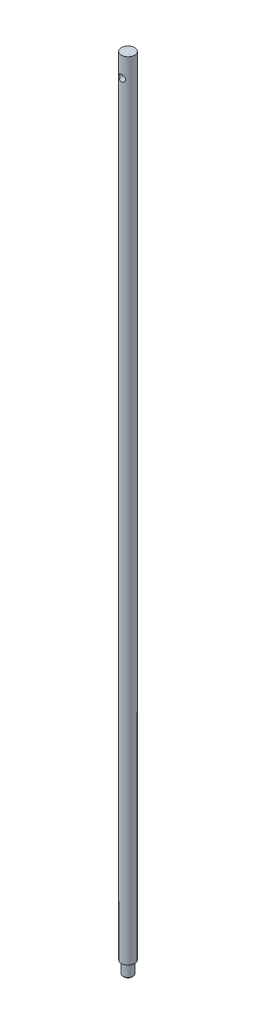
ISO-10303-21;
HEADER;
FILE_DESCRIPTION(('STEP AP214'),'2;1');
FILE_NAME('part.step','',(''),(''),'','','');
FILE_SCHEMA(('AUTOMOTIVE_DESIGN { 1 0 10303 214 1 1 1 1 }'));
ENDSEC;
DATA;
#1=APPLICATION_CONTEXT('core data for automotive mechanical design processes');
#2=APPLICATION_PROTOCOL_DEFINITION('international standard','automotive_design',2000,#1);
#3=PRODUCT_CONTEXT('',#1,'mechanical');
#4=PRODUCT('Part','Part','',(#3));
#5=PRODUCT_RELATED_PRODUCT_CATEGORY('part','',(#4));
#6=PRODUCT_DEFINITION_FORMATION('','',#4);
#7=PRODUCT_DEFINITION_CONTEXT('part definition',#1,'design');
#8=PRODUCT_DEFINITION('design','',#6,#7);
#9=PRODUCT_DEFINITION_SHAPE('','',#8);
#10=(LENGTH_UNIT() NAMED_UNIT(*) SI_UNIT(.MILLI.,.METRE.));
#11=(NAMED_UNIT(*) PLANE_ANGLE_UNIT() SI_UNIT($,.RADIAN.));
#12=(NAMED_UNIT(*) SI_UNIT($,.STERADIAN.) SOLID_ANGLE_UNIT());
#13=UNCERTAINTY_MEASURE_WITH_UNIT(LENGTH_MEASURE(1.E-05),#10,'distance_accuracy_value','');
#14=(GEOMETRIC_REPRESENTATION_CONTEXT(3) GLOBAL_UNCERTAINTY_ASSIGNED_CONTEXT((#13)) GLOBAL_UNIT_ASSIGNED_CONTEXT((#10,
#11,#12)) REPRESENTATION_CONTEXT('',''));
#15=CARTESIAN_POINT('',(0.,0.,0.));
#16=DIRECTION('',(0.,0.,1.));
#17=DIRECTION('',(1.,0.,0.));
#18=AXIS2_PLACEMENT_3D('',#15,#16,#17);
#19=CARTESIAN_POINT('',(-4.7625,0.,0.));
#20=DIRECTION('',(0.,1.,0.));
#21=DIRECTION('',(0.,0.,1.));
#22=AXIS2_PLACEMENT_3D('',#19,#20,#21);
#23=PLANE('',#22);
#24=CARTESIAN_POINT('',(0.,0.,0.));
#25=DIRECTION('',(0.,1.,0.));
#26=DIRECTION('',(0.,0.,1.));
#27=AXIS2_PLACEMENT_3D('',#24,#25,#26);
#28=CIRCLE('',#27,3.49250000000001);
#29=CARTESIAN_POINT('',(0.,0.,3.49250000000001));
#30=VERTEX_POINT('',#29);
#31=EDGE_CURVE('E64',#30,#30,#28,.F.);
#32=ORIENTED_EDGE('',*,*,#31,.T.);
#33=EDGE_LOOP('',(#32));
#34=FACE_BOUND('',#33,.T.);
#35=ADVANCED_FACE('F43',(#34),#23,.F.);
#36=CARTESIAN_POINT('',(0.,768.35,0.));
#37=DIRECTION('',(0.,-1.,0.));
#38=DIRECTION('',(0.,0.,-1.));
#39=AXIS2_PLACEMENT_3D('',#36,#37,#38);
#40=PLANE('',#39);
#41=CARTESIAN_POINT('',(0.,768.35,0.));
#42=DIRECTION('',(0.,-1.,0.));
#43=DIRECTION('',(0.,0.,-1.));
#44=AXIS2_PLACEMENT_3D('',#41,#42,#43);
#45=CIRCLE('',#44,6.35);
#46=CARTESIAN_POINT('',(0.,768.35,-6.35));
#47=VERTEX_POINT('',#46);
#48=EDGE_CURVE('E101',#47,#47,#45,.T.);
#49=ORIENTED_EDGE('',*,*,#48,.F.);
#50=EDGE_LOOP('',(#49));
#51=FACE_BOUND('',#50,.T.);
#52=ADVANCED_FACE('F91',(#51),#40,.F.);
#53=CARTESIAN_POINT('',(0.,0.,0.));
#54=DIRECTION('',(0.,-1.,0.));
#55=DIRECTION('',(0.,0.,-1.));
#56=AXIS2_PLACEMENT_3D('',#53,#54,#55);
#57=CYLINDRICAL_SURFACE('',#56,6.34999999999995);
#58=CARTESIAN_POINT('',(0.,752.475,-6.34999999999995));
#59=CARTESIAN_POINT('',(-0.0834969220594935,752.474999112282,-6.34999931166439));
#60=CARTESIAN_POINT('',(-0.167002655580029,752.471700125554,-6.34834758911697));
#61=CARTESIAN_POINT('',(-0.33337833025876,752.45855412545,-6.3417910582171));
#62=CARTESIAN_POINT('',(-0.41624797895575,752.448704263474,-6.33688483467109));
#63=CARTESIAN_POINT('',(-0.663182030646993,752.409427934954,-6.3174242674832));
#64=CARTESIAN_POINT('',(-0.825450146761548,752.370274922599,-6.2981282729942));
#65=CARTESIAN_POINT('',(-1.13965128900426,752.268009288706,-6.24891823135736));
#66=CARTESIAN_POINT('',(-1.29162180811868,752.204989780757,-6.2190454778682));
#67=CARTESIAN_POINT('',(-1.58264035037876,752.057263926371,-6.15142812041633));
#68=CARTESIAN_POINT('',(-1.72168939123014,751.972559289849,-6.11368413715873));
#69=CARTESIAN_POINT('',(-1.9923410884817,751.778030370266,-6.03111096182977));
#70=CARTESIAN_POINT('',(-2.12298433900093,751.666996422206,-5.98599127270812));
#71=CARTESIAN_POINT('',(-2.36467069069856,751.425603316427,-5.8947053559105));
#72=CARTESIAN_POINT('',(-2.47569885601321,751.295229570233,-5.84853836069038));
#73=CARTESIAN_POINT('',(-2.68368848497886,751.006579052247,-5.75623634934459));
#74=CARTESIAN_POINT('',(-2.77889135161934,750.846922468698,-5.71038146176782));
#75=CARTESIAN_POINT('',(-2.90019349951536,750.595452012825,-5.64919759286357));
#76=CARTESIAN_POINT('',(-2.93705266116893,750.509599938171,-5.63006420805927));
#77=CARTESIAN_POINT('',(-3.00322508739606,750.334414386294,-5.59504604853262));
#78=CARTESIAN_POINT('',(-3.03254280972159,750.245083001819,-5.57915935583423));
#79=CARTESIAN_POINT('',(-3.08174263292981,750.068989448035,-5.55212611635044));
#80=CARTESIAN_POINT('',(-3.10208128111977,749.982389205971,-5.54075429137741));
#81=CARTESIAN_POINT('',(-3.13545600360764,749.807412721006,-5.52193654886439));
#82=CARTESIAN_POINT('',(-3.14849595237256,749.719037446228,-5.5144885485113));
#83=CARTESIAN_POINT('',(-3.16707713053439,749.541293261151,-5.50383875782914));
#84=CARTESIAN_POINT('',(-3.17262287599649,749.451924982013,-5.50063441026517));
#85=CARTESIAN_POINT('',(-3.17614778806993,749.273019215822,-5.49859788398604));
#86=CARTESIAN_POINT('',(-3.17412767659872,749.183481745729,-5.49976528812793));
#87=CARTESIAN_POINT('',(-3.15811930330261,748.937252124276,-5.50899190362727));
#88=CARTESIAN_POINT('',(-3.13621253452965,748.781158270187,-5.52160857357702));
#89=CARTESIAN_POINT('',(-3.07003746372168,748.475353358693,-5.55866493052819));
#90=CARTESIAN_POINT('',(-3.02576203854505,748.325644350977,-5.58310838358071));
#91=CARTESIAN_POINT('',(-2.91531509833646,748.032455703436,-5.64157885407232));
#92=CARTESIAN_POINT('',(-2.84865758129414,747.889202390063,-5.67581583876126));
#93=CARTESIAN_POINT('',(-2.69570761526048,747.615233913826,-5.7500326880763));
#94=CARTESIAN_POINT('',(-2.60940634674624,747.484524420391,-5.79001512927801));
#95=CARTESIAN_POINT('',(-2.4068596424956,747.22189572575,-5.87734289018608));
#96=CARTESIAN_POINT('',(-2.28820488335247,747.091924615143,-5.92497898403933));
#97=CARTESIAN_POINT('',(-2.03058898448424,746.852914857136,-6.01813700574901));
#98=CARTESIAN_POINT('',(-1.89161819563548,746.743886213641,-6.06365791538153));
#99=CARTESIAN_POINT('',(-1.58913989972488,746.54509808028,-6.15003810597673));
#100=CARTESIAN_POINT('',(-1.42479265164794,746.45646851442,-6.19058274974566));
#101=CARTESIAN_POINT('',(-1.08098023585589,746.308841918365,-6.25976272299946));
#102=CARTESIAN_POINT('',(-0.901527205073952,746.249821358868,-6.2884075057894));
#103=CARTESIAN_POINT('',(-0.548533610626888,746.167940596601,-6.32854759690352));
#104=CARTESIAN_POINT('',(-0.375734359385299,746.142490327413,-6.3412667912299));
#105=CARTESIAN_POINT('',(-0.0278752299448881,746.12034947774,-6.3523181771632));
#106=CARTESIAN_POINT('',(0.14718353805996,746.123645272861,-6.35065718436125));
#107=CARTESIAN_POINT('',(0.480164686080307,746.157406235945,-6.33384535408395));
#108=CARTESIAN_POINT('',(0.63836362056414,746.185745791475,-6.31975005060427));
#109=CARTESIAN_POINT('',(0.947441883052949,746.26545587821,-6.28085393924117));
#110=CARTESIAN_POINT('',(1.09832040207135,746.316828948477,-6.25605195113511));
#111=CARTESIAN_POINT('',(1.39347133182507,746.442495130938,-6.1970999823633));
#112=CARTESIAN_POINT('',(1.53743151047818,746.517401584111,-6.16270299610714));
#113=CARTESIAN_POINT('',(1.81121482341037,746.687316425686,-6.0878711846566));
#114=CARTESIAN_POINT('',(1.94103189959924,746.782333377385,-6.04743378954676));
#115=CARTESIAN_POINT('',(2.19636241342673,747.000539350374,-5.95973602709936));
#116=CARTESIAN_POINT('',(2.32020134681973,747.125578607111,-5.91219559251095));
#117=CARTESIAN_POINT('',(2.54589381918869,747.39476235515,-5.81858093231365));
#118=CARTESIAN_POINT('',(2.64773214935249,747.538919952381,-5.77250773963542));
#119=CARTESIAN_POINT('',(2.83117262876716,747.851068601958,-5.68487535288736));
#120=CARTESIAN_POINT('',(2.91155594998013,748.01987576951,-5.64364281441816));
#121=CARTESIAN_POINT('',(3.04191297152938,748.37134446489,-5.57447679537315));
#122=CARTESIAN_POINT('',(3.09192585492219,748.553987797847,-5.54652618900863));
#123=CARTESIAN_POINT('',(3.15551086037918,748.90918995647,-5.51057765714597));
#124=CARTESIAN_POINT('',(3.17212027309711,749.081033750407,-5.50092192343239));
#125=CARTESIAN_POINT('',(3.17718805563876,749.425244442495,-5.49800001145353));
#126=CARTESIAN_POINT('',(3.16565862768385,749.597611081543,-5.50472672904435));
#127=CARTESIAN_POINT('',(3.11761548073658,749.920660103074,-5.53205211477778));
#128=CARTESIAN_POINT('',(3.08358651207688,750.071843941731,-5.55126823076263));
#129=CARTESIAN_POINT('',(2.9945816482881,750.366190830167,-5.59977978302575));
#130=CARTESIAN_POINT('',(2.93959901506,750.50935128285,-5.62907846127329));
#131=CARTESIAN_POINT('',(2.80611544421367,750.794233699429,-5.69685576337171));
#132=CARTESIAN_POINT('',(2.72628260503922,750.935212809366,-5.73581889480531));
#133=CARTESIAN_POINT('',(2.54682759156576,751.202697431723,-5.8177220708238));
#134=CARTESIAN_POINT('',(2.44719512169928,751.329195359943,-5.86066417820127));
#135=CARTESIAN_POINT('',(2.21680287661219,751.580097524177,-5.95192753761198));
#136=CARTESIAN_POINT('',(2.08373188558713,751.702379756413,-6.00026839877341));
#137=CARTESIAN_POINT('',(1.79751265125248,751.923397873233,-6.09212345576744));
#138=CARTESIAN_POINT('',(1.64435365457435,752.022121065983,-6.13563504323036));
#139=CARTESIAN_POINT('',(1.40178715704495,752.150280266197,-6.19391073190236));
#140=CARTESIAN_POINT('',(1.31842200030926,752.189800583681,-6.21223173271377));
#141=CARTESIAN_POINT('',(1.14807701021678,752.261599474824,-6.24595363475597));
#142=CARTESIAN_POINT('',(1.06109897786314,752.293881606534,-6.26135597012698));
#143=CARTESIAN_POINT('',(0.884361322813195,752.350759345915,-6.28875097111975));
#144=CARTESIAN_POINT('',(0.794608244970664,752.375371718138,-6.30075106809472));
#145=CARTESIAN_POINT('',(0.612925661591676,752.41666738953,-6.32100983571897));
#146=CARTESIAN_POINT('',(0.520997521680379,752.433355532193,-6.32927079168355));
#147=CARTESIAN_POINT('',(0.357531347524447,752.455616284862,-6.34032503263329));
#148=CARTESIAN_POINT('',(0.286274046488655,752.46287882125,-6.34394670812884));
#149=CARTESIAN_POINT('',(0.143346668941377,752.472571126538,-6.34878452045562));
#150=CARTESIAN_POINT('',(0.0716765810914404,752.475000762047,-6.35000059089047));
#151=CARTESIAN_POINT('',(0.,752.475,-6.34999999999995));
#152=B_SPLINE_CURVE_WITH_KNOTS('',3,(#58,#59,#60,#61,#62,#63,#64,#65,#66,#67,#68,#69,#70,#71,
#72,#73,#74,#75,#76,#77,#78,#79,#80,#81,#82,#83,#84,#85,#86,#87,#88,#89,#90,#91,#92,#93,#94,#95,
#96,#97,#98,#99,#100,#101,#102,#103,#104,#105,#106,#107,#108,#109,#110,#111,#112,#113,#114,#115,
#116,#117,#118,#119,#120,#121,#122,#123,#124,#125,#126,#127,#128,#129,#130,#131,#132,#133,#134,
#135,#136,#137,#138,#139,#140,#141,#142,#143,#144,#145,#146,#147,#148,#149,#150,#151),
.UNSPECIFIED.,.T.,.F.,(4,2,2,2,2,2,2,2,2,2,2,2,2,2,2,2,2,2,2,2,2,2,2,2,2,2,2,2,2,2,2,2,2,2,2,2,
2,2,2,2,2,2,2,2,2,2,4),(0.,0.250415612102661,0.500940186863995,1.00234854488127,
1.50182051324263,2.00125310940105,2.53090025348459,3.06094897410617,3.63210298373101,
3.91787290005985,4.20347350732848,4.47213270490095,4.74064915090143,5.00900371453884,
5.27733267302568,5.74927594687736,6.22136960256845,6.70445970327776,7.18776712794032,
7.73235646527883,8.27720530143642,8.84735553323659,9.41705196489298,9.93956405039334,
10.4618285011675,10.9436138594975,11.4254523397102,11.9210677568139,12.4168946391879,
12.9614122158798,13.5063050164601,14.0775857365549,14.6481278321883,15.1639000911419,
15.6794487286237,16.1458838633212,16.6124691169503,17.1104020806944,17.6085946442305,
18.1673210354481,18.7263477502426,19.0082017078365,19.2899168101042,19.5710117490932,
19.8519346536843,20.0668939492147,20.2818591776893),.UNSPECIFIED.);
#153=CARTESIAN_POINT('',(0.,752.475,-6.34999999999995));
#154=VERTEX_POINT('',#153);
#155=EDGE_CURVE('E10',#154,#154,#152,.T.);
#156=ORIENTED_EDGE('',*,*,#155,.T.);
#157=EDGE_LOOP('',(#156));
#158=FACE_BOUND('',#157,.T.);
#159=CARTESIAN_POINT('',(3.175,749.3,5.49926131403113));
#160=CARTESIAN_POINT('',(3.17499905676822,749.217238086467,5.49926232876908));
#161=CARTESIAN_POINT('',(3.1717573852825,749.134466084958,5.50113815093937));
#162=CARTESIAN_POINT('',(3.15884523354688,748.969579787141,5.50856077670449));
#163=CARTESIAN_POINT('',(3.14917176035639,748.887465815049,5.51410928932432));
#164=CARTESIAN_POINT('',(3.1106206547309,748.642834251589,5.53601678924098));
#165=CARTESIAN_POINT('',(3.07221261154101,748.482171953019,5.55763722742631));
#166=CARTESIAN_POINT('',(2.97211747978077,748.171402187854,5.61178865498308));
#167=CARTESIAN_POINT('',(2.91055413725168,748.021243559814,5.64426154586625));
#168=CARTESIAN_POINT('',(2.76627435445934,747.7333885772,5.7163554389004));
#169=CARTESIAN_POINT('',(2.6835567698406,747.595692897366,5.75597682772087));
#170=CARTESIAN_POINT('',(2.49131627779835,747.32417617866,5.8419003426749));
#171=CARTESIAN_POINT('',(2.38014521787044,747.191611402718,5.88848395338304));
#172=CARTESIAN_POINT('',(2.13758083606041,746.946029208745,5.98081052060141));
#173=CARTESIAN_POINT('',(2.00617748851795,746.833021541095,6.02655304768279));
#174=CARTESIAN_POINT('',(1.71605436473854,746.62230904715,6.1157318734657));
#175=CARTESIAN_POINT('',(1.55609032527594,746.52614922106,6.15880487346124));
#176=CARTESIAN_POINT('',(1.21969855929234,746.362677856888,6.23413651147236));
#177=CARTESIAN_POINT('',(1.04328130884107,746.295348112814,6.26640197156105));
#178=CARTESIAN_POINT('',(0.692292696730276,746.196422685461,6.31445464313233));
#179=CARTESIAN_POINT('',(0.518483183758065,746.162625253206,6.33125099630311));
#180=CARTESIAN_POINT('',(0.166911747158765,746.124472573822,6.35024078782232));
#181=CARTESIAN_POINT('',(-0.0108477196167591,746.120099512243,6.35244306187826));
#182=CARTESIAN_POINT('',(-0.348718268640283,746.140070701205,6.34247467450728));
#183=CARTESIAN_POINT('',(-0.509019820270758,746.161950743216,6.33153724004091));
#184=CARTESIAN_POINT('',(-0.8233212129554,746.229396635458,6.29838229153239));
#185=CARTESIAN_POINT('',(-0.977320581525335,746.274964258087,6.27616393341032));
#186=CARTESIAN_POINT('',(-1.27733236684471,746.388787314023,6.22209775234812));
#187=CARTESIAN_POINT('',(-1.4232048022068,746.457347920521,6.1901209546031));
#188=CARTESIAN_POINT('',(-1.70172616219335,746.614785720016,6.1194203240491));
#189=CARTESIAN_POINT('',(-1.83437032813199,746.703670186648,6.08069407688622));
#190=CARTESIAN_POINT('',(-2.09605211974372,746.908895301586,5.99580926070801));
#191=CARTESIAN_POINT('',(-2.22356359612802,747.027037090429,5.94929416927816));
#192=CARTESIAN_POINT('',(-2.45777846555891,747.28256239352,5.85642633307511));
#193=CARTESIAN_POINT('',(-2.56446584928027,747.41996057354,5.81007373990258));
#194=CARTESIAN_POINT('',(-2.76069102698822,747.720947768369,5.71957289604339));
#195=CARTESIAN_POINT('',(-2.84870951352552,747.885645911059,5.67575155752781));
#196=CARTESIAN_POINT('',(-2.95849503046448,748.143837566131,5.61885247415831));
#197=CARTESIAN_POINT('',(-2.9913876052029,748.231777928512,5.60135560040988));
#198=CARTESIAN_POINT('',(-3.04938956554739,748.410797438212,5.56999217748619));
#199=CARTESIAN_POINT('',(-3.07450375064141,748.501874611319,5.55612339050222));
#200=CARTESIAN_POINT('',(-3.11492823782861,748.679151631404,5.53355357587709));
#201=CARTESIAN_POINT('',(-3.13085491331033,748.765170642133,5.52453156228561));
#202=CARTESIAN_POINT('',(-3.15556797554225,748.938510627588,5.5104531349146));
#203=CARTESIAN_POINT('',(-3.16435807553687,749.025830901134,5.5053946589076));
#204=CARTESIAN_POINT('',(-3.17466835867007,749.201015148866,5.49945626530646));
#205=CARTESIAN_POINT('',(-3.17619124884848,749.28887890839,5.49857479177735));
#206=CARTESIAN_POINT('',(-3.17195985852084,749.464344837643,5.50101508803293));
#207=CARTESIAN_POINT('',(-3.16620606921981,749.551947024628,5.504336574101));
#208=CARTESIAN_POINT('',(-3.14018226453034,749.794092585645,5.51925588435839));
#209=CARTESIAN_POINT('',(-3.11209439281026,749.947605607529,5.5352861169902));
#210=CARTESIAN_POINT('',(-3.03433762958363,750.247346880593,5.57828096923586));
#211=CARTESIAN_POINT('',(-2.98466174914483,750.39357275552,5.60524912972104));
#212=CARTESIAN_POINT('',(-2.86273054239682,750.682422626649,5.66852625788955));
#213=CARTESIAN_POINT('',(-2.7895360038526,750.824566132032,5.70520999770135));
#214=CARTESIAN_POINT('',(-2.62346157669831,751.095367184771,5.78345646913636));
#215=CARTESIAN_POINT('',(-2.53057157570871,751.224017753442,5.82502170218948));
#216=CARTESIAN_POINT('',(-2.31405795861379,751.481156871519,5.9146440544015));
#217=CARTESIAN_POINT('',(-2.18803622695191,751.607580761702,5.96285904289678));
#218=CARTESIAN_POINT('',(-1.91580928554181,751.83813404752,6.05581193279057));
#219=CARTESIAN_POINT('',(-1.76959728537406,751.942255912323,6.10054865642867));
#220=CARTESIAN_POINT('',(-1.45584977269237,752.127571526682,6.18303824145359));
#221=CARTESIAN_POINT('',(-1.28785333421905,752.208087636826,6.22057562531781));
#222=CARTESIAN_POINT('',(-0.938283508313518,752.338912858229,6.28279651772882));
#223=CARTESIAN_POINT('',(-0.756722200806156,752.389248493874,6.30749131056502));
#224=CARTESIAN_POINT('',(-0.403160492410705,752.45394519054,6.33944338582811));
#225=CARTESIAN_POINT('',(-0.231811338563255,752.471183264302,6.34809271326655));
#226=CARTESIAN_POINT('',(0.111525009731752,752.477677359425,6.35133763722961));
#227=CARTESIAN_POINT('',(0.283511959769373,752.466943176285,6.34593815345485));
#228=CARTESIAN_POINT('',(0.611308110350819,752.419702940442,6.32250351776751));
#229=CARTESIAN_POINT('',(0.767436553820594,752.384941720137,6.3053244315158));
#230=CARTESIAN_POINT('',(1.07139095342125,752.292986660666,6.26084894800274));
#231=CARTESIAN_POINT('',(1.2192157154418,752.235789604509,6.23355109988085));
#232=CARTESIAN_POINT('',(1.50946910032137,752.098042062138,6.1698484014477));
#233=CARTESIAN_POINT('',(1.65139651176324,752.016597371874,6.1331039773464));
#234=CARTESIAN_POINT('',(1.92016030444467,751.833781845671,6.05434784579287));
#235=CARTESIAN_POINT('',(2.04698971133071,751.732401857745,6.01233372232383));
#236=CARTESIAN_POINT('',(2.29524860659576,751.500926168705,5.92228494250566));
#237=CARTESIAN_POINT('',(2.41488454123009,751.368976768848,5.87406724075606));
#238=CARTESIAN_POINT('',(2.63101905620377,751.086066269459,5.780496540644));
#239=CARTESIAN_POINT('',(2.72749716677433,750.935088528742,5.73514610261333));
#240=CARTESIAN_POINT('',(2.85396050304137,750.694320518755,5.67271720109889));
#241=CARTESIAN_POINT('',(2.89354057606828,750.610242277294,5.65257123598784));
#242=CARTESIAN_POINT('',(2.96535747654721,750.438392775482,5.61522862075762));
#243=CARTESIAN_POINT('',(2.99759808643803,750.350623445117,5.59803045260688));
#244=CARTESIAN_POINT('',(3.05427194354529,750.172230991575,5.56731186793825));
#245=CARTESIAN_POINT('',(3.07872527562272,750.08161588317,5.55378200380451));
#246=CARTESIAN_POINT('',(3.11956903021306,749.898111521459,5.53094387019907));
#247=CARTESIAN_POINT('',(3.13596509002515,749.805223906026,5.52163264949541));
#248=CARTESIAN_POINT('',(3.15710761797221,749.643536251204,5.50956192150403));
#249=CARTESIAN_POINT('',(3.16381073091702,749.57506632724,5.50570868405775));
#250=CARTESIAN_POINT('',(3.17275746355016,749.437733281387,5.50055787263121));
#251=CARTESIAN_POINT('',(3.17500078490812,749.368870133503,5.49926046961932));
#252=CARTESIAN_POINT('',(3.175,749.3,5.49926131403113));
#253=B_SPLINE_CURVE_WITH_KNOTS('',3,(#159,#160,#161,#162,#163,#164,#165,#166,#167,#168,#169,
#170,#171,#172,#173,#174,#175,#176,#177,#178,#179,#180,#181,#182,#183,#184,#185,#186,#187,#188,
#189,#190,#191,#192,#193,#194,#195,#196,#197,#198,#199,#200,#201,#202,#203,#204,#205,#206,#207,
#208,#209,#210,#211,#212,#213,#214,#215,#216,#217,#218,#219,#220,#221,#222,#223,#224,#225,#226,
#227,#228,#229,#230,#231,#232,#233,#234,#235,#236,#237,#238,#239,#240,#241,#242,#243,#244,#245,
#246,#247,#248,#249,#250,#251,#252),.UNSPECIFIED.,.T.,.F.,(4,2,2,2,2,2,2,2,2,2,2,2,2,2,2,2,2,2,
2,2,2,2,2,2,2,2,2,2,2,2,2,2,2,2,2,2,2,2,2,2,2,2,2,2,2,2,4),(0.,0.248210314193359,
0.496536210172951,0.993616655653437,1.48807751301476,1.98256512428754,2.51783706318111,
3.05337510292803,3.62501229958004,4.19628797710287,4.72691486873124,5.25722047303104,
5.74141031613335,6.22563639342848,6.71656194871311,7.2076634753704,7.74518754975552,
8.28312325280723,8.85521994590929,9.14138502893499,9.42737318655806,9.69083660833552,
9.95416285897619,10.2173910127767,10.4806013985705,10.9489167635523,11.4173838546847,
11.907548100733,12.3979646273263,12.9502005485242,13.5026226528977,14.0696241997014,
14.6361266987683,15.150651024706,15.6649951955483,16.1454469295097,16.6259675788461,
17.127040275183,17.6283435455375,18.1795366185795,18.7312151251734,19.0161455987001,
19.300928897391,19.5849716229021,19.8688153329579,20.0753491522869,20.2818967868888),.UNSPECIFIED.);
#254=CARTESIAN_POINT('',(3.175,749.3,5.49926131403113));
#255=VERTEX_POINT('',#254);
#256=EDGE_CURVE('E56',#255,#255,#253,.T.);
#257=ORIENTED_EDGE('',*,*,#256,.T.);
#258=EDGE_LOOP('',(#257));
#259=FACE_BOUND('',#258,.T.);
#260=CARTESIAN_POINT('',(0.,12.7,0.));
#261=DIRECTION('',(0.,-1.,0.));
#262=DIRECTION('',(0.,0.,-1.));
#263=AXIS2_PLACEMENT_3D('',#260,#261,#262);
#264=CIRCLE('',#263,6.34999999999991);
#265=CARTESIAN_POINT('',(0.,12.7,-6.34999999999991));
#266=VERTEX_POINT('',#265);
#267=EDGE_CURVE('E103',#266,#266,#264,.T.);
#268=ORIENTED_EDGE('',*,*,#267,.F.);
#269=EDGE_LOOP('',(#268));
#270=FACE_BOUND('',#269,.T.);
#271=ORIENTED_EDGE('',*,*,#48,.T.);
#272=EDGE_LOOP('',(#271));
#273=FACE_BOUND('',#272,.T.);
#274=ADVANCED_FACE('F70',(#158,#259,#270,#273),#57,.T.);
#275=CARTESIAN_POINT('',(-6.34999999999991,12.7,0.));
#276=DIRECTION('',(0.,1.,0.));
#277=DIRECTION('',(0.,0.,1.));
#278=AXIS2_PLACEMENT_3D('',#275,#276,#277);
#279=PLANE('',#278);
#280=CARTESIAN_POINT('',(0.,12.7,0.));
#281=DIRECTION('',(0.,-1.,0.));
#282=DIRECTION('',(0.,0.,-1.));
#283=AXIS2_PLACEMENT_3D('',#280,#281,#282);
#284=CIRCLE('',#283,4.7625);
#285=CARTESIAN_POINT('',(0.,12.7,-4.7625));
#286=VERTEX_POINT('',#285);
#287=EDGE_CURVE('E108',#286,#286,#284,.T.);
#288=ORIENTED_EDGE('',*,*,#287,.F.);
#289=EDGE_LOOP('',(#288));
#290=FACE_BOUND('',#289,.T.);
#291=ORIENTED_EDGE('',*,*,#267,.T.);
#292=EDGE_LOOP('',(#291));
#293=FACE_BOUND('',#292,.T.);
#294=ADVANCED_FACE('F82',(#290,#293),#279,.F.);
#295=CARTESIAN_POINT('',(0.,0.,0.));
#296=DIRECTION('',(0.,-1.,0.));
#297=DIRECTION('',(0.,0.,-1.));
#298=AXIS2_PLACEMENT_3D('',#295,#296,#297);
#299=CYLINDRICAL_SURFACE('',#298,4.7625);
#300=CARTESIAN_POINT('',(0.,1.27000000000001,0.));
#301=DIRECTION('',(0.,1.,0.));
#302=DIRECTION('',(0.,0.,1.));
#303=AXIS2_PLACEMENT_3D('',#300,#301,#302);
#304=CIRCLE('',#303,4.7625);
#305=CARTESIAN_POINT('',(0.,1.27000000000001,4.7625));
#306=VERTEX_POINT('',#305);
#307=EDGE_CURVE('E60',#306,#306,#304,.T.);
#308=ORIENTED_EDGE('',*,*,#307,.T.);
#309=EDGE_LOOP('',(#308));
#310=FACE_BOUND('',#309,.T.);
#311=ORIENTED_EDGE('',*,*,#287,.T.);
#312=EDGE_LOOP('',(#311));
#313=FACE_BOUND('',#312,.T.);
#314=ADVANCED_FACE('F79',(#310,#313),#299,.T.);
#315=CARTESIAN_POINT('',(0.,0.,0.));
#316=DIRECTION('',(0.,1.,0.));
#317=DIRECTION('',(0.,0.,1.));
#318=AXIS2_PLACEMENT_3D('',#315,#316,#317);
#319=CONICAL_SURFACE('',#318,3.49250000000001,0.785398163397442);
#320=ORIENTED_EDGE('',*,*,#307,.F.);
#321=EDGE_LOOP('',(#320));
#322=FACE_BOUND('',#321,.T.);
#323=ORIENTED_EDGE('',*,*,#31,.F.);
#324=EDGE_LOOP('',(#323));
#325=FACE_BOUND('',#324,.T.);
#326=ADVANCED_FACE('F46',(#322,#325),#319,.T.);
#327=CARTESIAN_POINT('',(0.,749.3,-6.35));
#328=DIRECTION('',(0.,0.,1.));
#329=DIRECTION('',(1.,0.,0.));
#330=AXIS2_PLACEMENT_3D('',#327,#328,#329);
#331=CYLINDRICAL_SURFACE('',#330,3.175);
#332=ORIENTED_EDGE('',*,*,#256,.F.);
#333=EDGE_LOOP('',(#332));
#334=FACE_BOUND('',#333,.T.);
#335=ORIENTED_EDGE('',*,*,#155,.F.);
#336=EDGE_LOOP('',(#335));
#337=FACE_BOUND('',#336,.T.);
#338=ADVANCED_FACE('F74',(#334,#337),#331,.F.);
#339=CLOSED_SHELL('',(#35,#52,#274,#294,#314,#326,#338));
#340=MANIFOLD_SOLID_BREP('B2',#339);
#341=ADVANCED_BREP_SHAPE_REPRESENTATION('',(#18,#340),#14);
#342=SHAPE_DEFINITION_REPRESENTATION(#9,#341);
ENDSEC;
END-ISO-10303-21;
